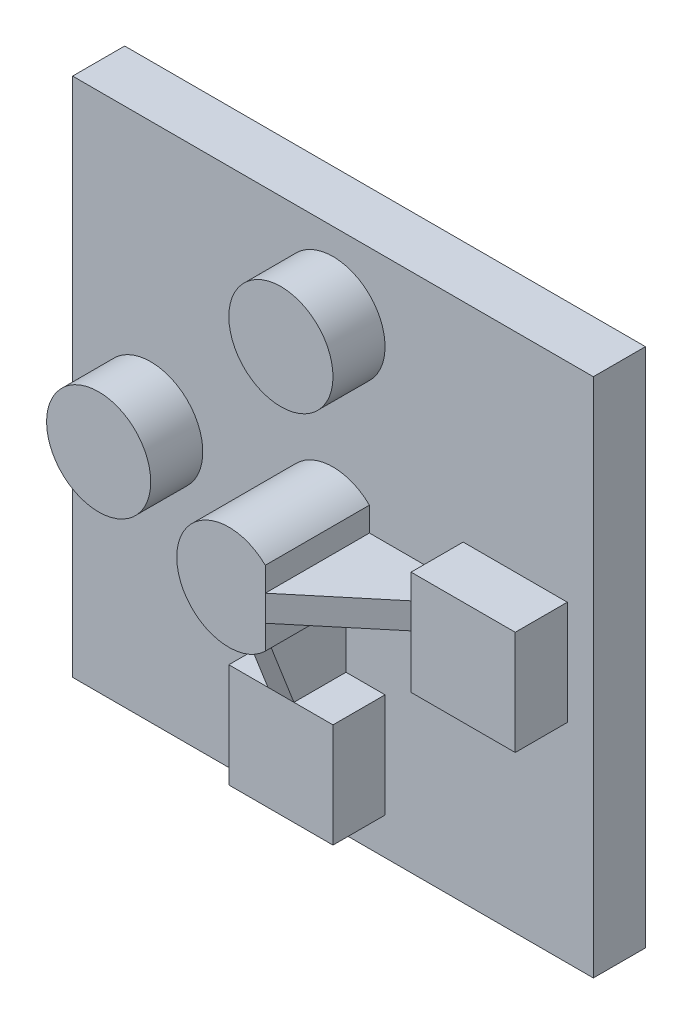
ISO-10303-21;
HEADER;
FILE_DESCRIPTION(('STEP AP214'),'2;1');
FILE_NAME('part.step','',(''),(''),'','','');
FILE_SCHEMA(('AUTOMOTIVE_DESIGN { 1 0 10303 214 1 1 1 1 }'));
ENDSEC;
DATA;
#1=APPLICATION_CONTEXT('core data for automotive mechanical design processes');
#2=APPLICATION_PROTOCOL_DEFINITION('international standard','automotive_design',2000,#1);
#3=PRODUCT_CONTEXT('',#1,'mechanical');
#4=PRODUCT('Part','Part','',(#3));
#5=PRODUCT_RELATED_PRODUCT_CATEGORY('part','',(#4));
#6=PRODUCT_DEFINITION_FORMATION('','',#4);
#7=PRODUCT_DEFINITION_CONTEXT('part definition',#1,'design');
#8=PRODUCT_DEFINITION('design','',#6,#7);
#9=PRODUCT_DEFINITION_SHAPE('','',#8);
#10=(LENGTH_UNIT() NAMED_UNIT(*) SI_UNIT(.MILLI.,.METRE.));
#11=(NAMED_UNIT(*) PLANE_ANGLE_UNIT() SI_UNIT($,.RADIAN.));
#12=(NAMED_UNIT(*) SI_UNIT($,.STERADIAN.) SOLID_ANGLE_UNIT());
#13=UNCERTAINTY_MEASURE_WITH_UNIT(LENGTH_MEASURE(1.E-05),#10,'distance_accuracy_value','');
#14=(GEOMETRIC_REPRESENTATION_CONTEXT(3) GLOBAL_UNCERTAINTY_ASSIGNED_CONTEXT((#13)) GLOBAL_UNIT_ASSIGNED_CONTEXT((#10,
#11,#12)) REPRESENTATION_CONTEXT('',''));
#15=CARTESIAN_POINT('',(0.,0.,0.));
#16=DIRECTION('',(0.,0.,1.));
#17=DIRECTION('',(1.,0.,0.));
#18=AXIS2_PLACEMENT_3D('',#15,#16,#17);
#19=CARTESIAN_POINT('',(0.,27.0986065540472,15.));
#20=DIRECTION('',(0.,1.,0.));
#21=DIRECTION('',(0.,0.,1.));
#22=AXIS2_PLACEMENT_3D('',#19,#20,#21);
#23=PLANE('',#22);
#24=DIRECTION('',(1.,0.,0.));
#25=VECTOR('',#24,1.);
#26=CARTESIAN_POINT('',(0.,27.0986065540472,5.));
#27=LINE('',#26,#25);
#28=CARTESIAN_POINT('',(52.5,27.0986065540472,5.));
#29=VERTEX_POINT('',#28);
#30=CARTESIAN_POINT('',(60.,27.0986065540472,5.));
#31=VERTEX_POINT('',#30);
#32=EDGE_CURVE('E322',#29,#31,#27,.T.);
#33=ORIENTED_EDGE('',*,*,#32,.F.);
#34=DIRECTION('',(0.,0.,1.));
#35=VECTOR('',#34,1.);
#36=CARTESIAN_POINT('',(52.5,27.0986065540472,15.));
#37=LINE('',#36,#35);
#38=CARTESIAN_POINT('',(52.5,27.0986065540472,15.));
#39=VERTEX_POINT('',#38);
#40=EDGE_CURVE('E219',#29,#39,#37,.T.);
#41=ORIENTED_EDGE('',*,*,#40,.T.);
#42=DIRECTION('',(1.,0.,0.));
#43=VECTOR('',#42,1.);
#44=CARTESIAN_POINT('',(0.,27.0986065540472,15.));
#45=LINE('',#44,#43);
#46=CARTESIAN_POINT('',(60.,27.0986065540472,15.));
#47=VERTEX_POINT('',#46);
#48=EDGE_CURVE('E311',#39,#47,#45,.T.);
#49=ORIENTED_EDGE('',*,*,#48,.T.);
#50=DIRECTION('',(0.,0.,-1.));
#51=VECTOR('',#50,1.);
#52=CARTESIAN_POINT('',(60.,27.0986065540472,15.));
#53=LINE('',#52,#51);
#54=EDGE_CURVE('E337',#47,#31,#53,.T.);
#55=ORIENTED_EDGE('',*,*,#54,.T.);
#56=EDGE_LOOP('',(#33,#41,#49,#55));
#57=FACE_BOUND('',#56,.T.);
#58=ADVANCED_FACE('F43',(#57),#23,.T.);
#59=CARTESIAN_POINT('',(57.,0.,25.));
#60=DIRECTION('',(1.,0.,0.));
#61=DIRECTION('',(0.,0.,-1.));
#62=AXIS2_PLACEMENT_3D('',#59,#60,#61);
#63=PLANE('',#62);
#64=DIRECTION('',(0.,-1.,0.));
#65=VECTOR('',#64,1.);
#66=CARTESIAN_POINT('',(57.,0.,25.));
#67=LINE('',#66,#65);
#68=CARTESIAN_POINT('',(57.,57.1414284285429,25.));
#69=VERTEX_POINT('',#68);
#70=CARTESIAN_POINT('',(57.,52.5,25.));
#71=VERTEX_POINT('',#70);
#72=EDGE_CURVE('E252',#69,#71,#67,.T.);
#73=ORIENTED_EDGE('',*,*,#72,.T.);
#74=DIRECTION('',(0.,0.,-1.));
#75=VECTOR('',#74,1.);
#76=CARTESIAN_POINT('',(57.,52.5,25.));
#77=LINE('',#76,#75);
#78=CARTESIAN_POINT('',(57.,52.5,5.));
#79=VERTEX_POINT('',#78);
#80=EDGE_CURVE('E232',#71,#79,#77,.T.);
#81=ORIENTED_EDGE('',*,*,#80,.T.);
#82=DIRECTION('',(0.,-1.,0.));
#83=VECTOR('',#82,1.);
#84=CARTESIAN_POINT('',(57.,0.,5.));
#85=LINE('',#84,#83);
#86=CARTESIAN_POINT('',(57.,57.1414284285429,5.));
#87=VERTEX_POINT('',#86);
#88=EDGE_CURVE('E260',#87,#79,#85,.T.);
#89=ORIENTED_EDGE('',*,*,#88,.F.);
#90=DIRECTION('',(0.,0.,-1.));
#91=VECTOR('',#90,1.);
#92=CARTESIAN_POINT('',(57.,57.1414284285429,25.));
#93=LINE('',#92,#91);
#94=EDGE_CURVE('E268',#69,#87,#93,.T.);
#95=ORIENTED_EDGE('',*,*,#94,.F.);
#96=EDGE_LOOP('',(#73,#81,#89,#95));
#97=FACE_BOUND('',#96,.T.);
#98=ADVANCED_FACE('F379',(#97),#63,.T.);
#99=CARTESIAN_POINT('',(0.,0.,5.));
#100=DIRECTION('',(0.,0.,-1.));
#101=DIRECTION('',(-1.,0.,0.));
#102=AXIS2_PLACEMENT_3D('',#99,#100,#101);
#103=PLANE('',#102);
#104=DIRECTION('',(0.,-1.,0.));
#105=VECTOR('',#104,1.);
#106=CARTESIAN_POINT('',(60.,0.,5.));
#107=LINE('',#106,#105);
#108=CARTESIAN_POINT('',(60.,7.09860655404718,5.));
#109=VERTEX_POINT('',#108);
#110=EDGE_CURVE('E307',#31,#109,#107,.T.);
#111=ORIENTED_EDGE('',*,*,#110,.T.);
#112=DIRECTION('',(1.,0.,0.));
#113=VECTOR('',#112,1.);
#114=CARTESIAN_POINT('',(0.,7.09860655404718,5.));
#115=LINE('',#114,#113);
#116=CARTESIAN_POINT('',(40.,7.09860655404718,5.));
#117=VERTEX_POINT('',#116);
#118=EDGE_CURVE('E312',#117,#109,#115,.T.);
#119=ORIENTED_EDGE('',*,*,#118,.F.);
#120=DIRECTION('',(0.,-1.,0.));
#121=VECTOR('',#120,1.);
#122=CARTESIAN_POINT('',(40.,0.,5.));
#123=LINE('',#122,#121);
#124=CARTESIAN_POINT('',(40.,27.0986065540472,5.));
#125=VERTEX_POINT('',#124);
#126=EDGE_CURVE('E325',#125,#117,#123,.T.);
#127=ORIENTED_EDGE('',*,*,#126,.F.);
#128=CARTESIAN_POINT('',(47.5,27.0986065540472,5.));
#129=VERTEX_POINT('',#128);
#130=EDGE_CURVE('E323',#125,#129,#27,.T.);
#131=ORIENTED_EDGE('',*,*,#130,.T.);
#132=DIRECTION('',(0.,1.,0.));
#133=VECTOR('',#132,1.);
#134=CARTESIAN_POINT('',(47.5,0.,5.));
#135=LINE('',#134,#133);
#136=CARTESIAN_POINT('',(47.5,40.3175416344815,5.));
#137=VERTEX_POINT('',#136);
#138=EDGE_CURVE('E222',#129,#137,#135,.T.);
#139=ORIENTED_EDGE('',*,*,#138,.T.);
#140=CARTESIAN_POINT('',(50.,50.,5.));
#141=DIRECTION('',(0.,0.,1.));
#142=DIRECTION('',(1.,0.,0.));
#143=AXIS2_PLACEMENT_3D('',#140,#141,#142);
#144=CIRCLE('',#143,10.);
#145=EDGE_CURVE('E264',#87,#137,#144,.T.);
#146=ORIENTED_EDGE('',*,*,#145,.F.);
#147=ORIENTED_EDGE('',*,*,#88,.T.);
#148=DIRECTION('',(-1.,0.,0.));
#149=VECTOR('',#148,1.);
#150=CARTESIAN_POINT('',(0.,52.5,5.));
#151=LINE('',#150,#149);
#152=CARTESIAN_POINT('',(75.,52.5,5.));
#153=VERTEX_POINT('',#152);
#154=EDGE_CURVE('E236',#153,#79,#151,.T.);
#155=ORIENTED_EDGE('',*,*,#154,.F.);
#156=DIRECTION('',(0.,-1.,0.));
#157=VECTOR('',#156,1.);
#158=CARTESIAN_POINT('',(75.,0.,5.));
#159=LINE('',#158,#157);
#160=CARTESIAN_POINT('',(75.,60.,5.));
#161=VERTEX_POINT('',#160);
#162=EDGE_CURVE('E291',#161,#153,#159,.T.);
#163=ORIENTED_EDGE('',*,*,#162,.F.);
#164=DIRECTION('',(1.,0.,0.));
#165=VECTOR('',#164,1.);
#166=CARTESIAN_POINT('',(0.,60.,5.));
#167=LINE('',#166,#165);
#168=CARTESIAN_POINT('',(95.,60.,5.));
#169=VERTEX_POINT('',#168);
#170=EDGE_CURVE('E288',#161,#169,#167,.T.);
#171=ORIENTED_EDGE('',*,*,#170,.T.);
#172=DIRECTION('',(0.,-1.,0.));
#173=VECTOR('',#172,1.);
#174=CARTESIAN_POINT('',(95.,0.,5.));
#175=LINE('',#174,#173);
#176=CARTESIAN_POINT('',(95.,40.,5.));
#177=VERTEX_POINT('',#176);
#178=EDGE_CURVE('E274',#169,#177,#175,.T.);
#179=ORIENTED_EDGE('',*,*,#178,.T.);
#180=DIRECTION('',(1.,0.,0.));
#181=VECTOR('',#180,1.);
#182=CARTESIAN_POINT('',(0.,40.,5.));
#183=LINE('',#182,#181);
#184=CARTESIAN_POINT('',(75.,40.,5.));
#185=VERTEX_POINT('',#184);
#186=EDGE_CURVE('E279',#185,#177,#183,.T.);
#187=ORIENTED_EDGE('',*,*,#186,.F.);
#188=CARTESIAN_POINT('',(75.,47.5,5.));
#189=VERTEX_POINT('',#188);
#190=EDGE_CURVE('E290',#189,#185,#159,.T.);
#191=ORIENTED_EDGE('',*,*,#190,.F.);
#192=DIRECTION('',(-1.,0.,0.));
#193=VECTOR('',#192,1.);
#194=CARTESIAN_POINT('',(0.,47.5,5.));
#195=LINE('',#194,#193);
#196=CARTESIAN_POINT('',(57.,47.5,5.));
#197=VERTEX_POINT('',#196);
#198=EDGE_CURVE('E245',#189,#197,#195,.T.);
#199=ORIENTED_EDGE('',*,*,#198,.T.);
#200=CARTESIAN_POINT('',(57.,42.8585715714571,5.));
#201=VERTEX_POINT('',#200);
#202=EDGE_CURVE('E251',#197,#201,#85,.T.);
#203=ORIENTED_EDGE('',*,*,#202,.T.);
#204=CARTESIAN_POINT('',(52.5,40.3175416344815,5.));
#205=VERTEX_POINT('',#204);
#206=EDGE_CURVE('E263',#205,#201,#144,.T.);
#207=ORIENTED_EDGE('',*,*,#206,.F.);
#208=DIRECTION('',(0.,1.,0.));
#209=VECTOR('',#208,1.);
#210=CARTESIAN_POINT('',(52.5,0.,5.));
#211=LINE('',#210,#209);
#212=EDGE_CURVE('E58',#29,#205,#211,.T.);
#213=ORIENTED_EDGE('',*,*,#212,.F.);
#214=ORIENTED_EDGE('',*,*,#32,.T.);
#215=EDGE_LOOP('',(#111,#119,#127,#131,#139,#146,#147,#155,#163,#171,#179,#187,#191,#199,#203,
#207,#213,#214));
#216=FACE_BOUND('',#215,.T.);
#217=CARTESIAN_POINT('',(50.,85.,5.));
#218=DIRECTION('',(0.,0.,-1.));
#219=DIRECTION('',(-1.,0.,0.));
#220=AXIS2_PLACEMENT_3D('',#217,#218,#219);
#221=CIRCLE('',#220,10.);
#222=CARTESIAN_POINT('',(40.,85.,5.));
#223=VERTEX_POINT('',#222);
#224=EDGE_CURVE('E51',#223,#223,#221,.F.);
#225=ORIENTED_EDGE('',*,*,#224,.F.);
#226=EDGE_LOOP('',(#225));
#227=FACE_BOUND('',#226,.T.);
#228=DIRECTION('',(-1.,0.,0.));
#229=VECTOR('',#228,1.);
#230=CARTESIAN_POINT('',(0.,100.,5.));
#231=LINE('',#230,#229);
#232=CARTESIAN_POINT('',(100.,100.,5.));
#233=VERTEX_POINT('',#232);
#234=CARTESIAN_POINT('',(0.,100.,5.));
#235=VERTEX_POINT('',#234);
#236=EDGE_CURVE('E351',#233,#235,#231,.T.);
#237=ORIENTED_EDGE('',*,*,#236,.T.);
#238=DIRECTION('',(0.,-1.,0.));
#239=VECTOR('',#238,1.);
#240=CARTESIAN_POINT('',(0.,0.,5.));
#241=LINE('',#240,#239);
#242=CARTESIAN_POINT('',(0.,0.,5.));
#243=VERTEX_POINT('',#242);
#244=EDGE_CURVE('E344',#235,#243,#241,.T.);
#245=ORIENTED_EDGE('',*,*,#244,.T.);
#246=DIRECTION('',(1.,0.,0.));
#247=VECTOR('',#246,1.);
#248=CARTESIAN_POINT('',(100.,0.,5.));
#249=LINE('',#248,#247);
#250=CARTESIAN_POINT('',(100.,0.,5.));
#251=VERTEX_POINT('',#250);
#252=EDGE_CURVE('E346',#243,#251,#249,.T.);
#253=ORIENTED_EDGE('',*,*,#252,.T.);
#254=DIRECTION('',(0.,1.,0.));
#255=VECTOR('',#254,1.);
#256=CARTESIAN_POINT('',(100.,100.,5.));
#257=LINE('',#256,#255);
#258=EDGE_CURVE('E349',#251,#233,#257,.T.);
#259=ORIENTED_EDGE('',*,*,#258,.T.);
#260=EDGE_LOOP('',(#237,#245,#253,#259));
#261=FACE_BOUND('',#260,.T.);
#262=CARTESIAN_POINT('',(15.,50.,5.));
#263=DIRECTION('',(0.,0.,-1.));
#264=DIRECTION('',(-1.,0.,0.));
#265=AXIS2_PLACEMENT_3D('',#262,#263,#264);
#266=CIRCLE('',#265,10.);
#267=CARTESIAN_POINT('',(4.99999999999999,50.,5.));
#268=VERTEX_POINT('',#267);
#269=EDGE_CURVE('E11',#268,#268,#266,.F.);
#270=ORIENTED_EDGE('',*,*,#269,.F.);
#271=EDGE_LOOP('',(#270));
#272=FACE_BOUND('',#271,.T.);
#273=ADVANCED_FACE('F376',(#216,#227,#261,#272),#103,.F.);
#274=CARTESIAN_POINT('',(0.,0.,5.));
#275=DIRECTION('',(1.,0.,0.));
#276=DIRECTION('',(0.,0.,-1.));
#277=AXIS2_PLACEMENT_3D('',#274,#275,#276);
#278=PLANE('',#277);
#279=DIRECTION('',(0.,0.,-1.));
#280=VECTOR('',#279,1.);
#281=CARTESIAN_POINT('',(0.,0.,5.));
#282=LINE('',#281,#280);
#283=CARTESIAN_POINT('',(0.,0.,-5.));
#284=VERTEX_POINT('',#283);
#285=EDGE_CURVE('E368',#243,#284,#282,.T.);
#286=ORIENTED_EDGE('',*,*,#285,.F.);
#287=ORIENTED_EDGE('',*,*,#244,.F.);
#288=DIRECTION('',(0.,0.,-1.));
#289=VECTOR('',#288,1.);
#290=CARTESIAN_POINT('',(0.,100.,5.));
#291=LINE('',#290,#289);
#292=CARTESIAN_POINT('',(0.,100.,-5.));
#293=VERTEX_POINT('',#292);
#294=EDGE_CURVE('E353',#235,#293,#291,.T.);
#295=ORIENTED_EDGE('',*,*,#294,.T.);
#296=DIRECTION('',(0.,-1.,0.));
#297=VECTOR('',#296,1.);
#298=CARTESIAN_POINT('',(0.,0.,-5.));
#299=LINE('',#298,#297);
#300=EDGE_CURVE('E343',#293,#284,#299,.T.);
#301=ORIENTED_EDGE('',*,*,#300,.T.);
#302=EDGE_LOOP('',(#286,#287,#295,#301));
#303=FACE_BOUND('',#302,.T.);
#304=ADVANCED_FACE('F45',(#303),#278,.F.);
#305=CARTESIAN_POINT('',(100.,0.,5.));
#306=DIRECTION('',(0.,1.,0.));
#307=DIRECTION('',(0.,0.,1.));
#308=AXIS2_PLACEMENT_3D('',#305,#306,#307);
#309=PLANE('',#308);
#310=DIRECTION('',(1.,0.,0.));
#311=VECTOR('',#310,1.);
#312=CARTESIAN_POINT('',(100.,0.,-5.));
#313=LINE('',#312,#311);
#314=CARTESIAN_POINT('',(100.,0.,-5.));
#315=VERTEX_POINT('',#314);
#316=EDGE_CURVE('E355',#284,#315,#313,.T.);
#317=ORIENTED_EDGE('',*,*,#316,.T.);
#318=DIRECTION('',(0.,0.,-1.));
#319=VECTOR('',#318,1.);
#320=CARTESIAN_POINT('',(100.,0.,5.));
#321=LINE('',#320,#319);
#322=EDGE_CURVE('E365',#251,#315,#321,.T.);
#323=ORIENTED_EDGE('',*,*,#322,.F.);
#324=ORIENTED_EDGE('',*,*,#252,.F.);
#325=ORIENTED_EDGE('',*,*,#285,.T.);
#326=EDGE_LOOP('',(#317,#323,#324,#325));
#327=FACE_BOUND('',#326,.T.);
#328=ADVANCED_FACE('F442',(#327),#309,.F.);
#329=CARTESIAN_POINT('',(100.,100.,5.));
#330=DIRECTION('',(-1.,0.,0.));
#331=DIRECTION('',(0.,-1.,0.));
#332=AXIS2_PLACEMENT_3D('',#329,#330,#331);
#333=PLANE('',#332);
#334=DIRECTION('',(0.,1.,0.));
#335=VECTOR('',#334,1.);
#336=CARTESIAN_POINT('',(100.,100.,-5.));
#337=LINE('',#336,#335);
#338=CARTESIAN_POINT('',(100.,100.,-5.));
#339=VERTEX_POINT('',#338);
#340=EDGE_CURVE('E357',#315,#339,#337,.T.);
#341=ORIENTED_EDGE('',*,*,#340,.T.);
#342=DIRECTION('',(0.,0.,-1.));
#343=VECTOR('',#342,1.);
#344=CARTESIAN_POINT('',(100.,100.,5.));
#345=LINE('',#344,#343);
#346=EDGE_CURVE('E362',#233,#339,#345,.T.);
#347=ORIENTED_EDGE('',*,*,#346,.F.);
#348=ORIENTED_EDGE('',*,*,#258,.F.);
#349=ORIENTED_EDGE('',*,*,#322,.T.);
#350=EDGE_LOOP('',(#341,#347,#348,#349));
#351=FACE_BOUND('',#350,.T.);
#352=ADVANCED_FACE('F439',(#351),#333,.F.);
#353=CARTESIAN_POINT('',(0.,100.,5.));
#354=DIRECTION('',(0.,-1.,0.));
#355=DIRECTION('',(0.,0.,-1.));
#356=AXIS2_PLACEMENT_3D('',#353,#354,#355);
#357=PLANE('',#356);
#358=ORIENTED_EDGE('',*,*,#294,.F.);
#359=ORIENTED_EDGE('',*,*,#236,.F.);
#360=ORIENTED_EDGE('',*,*,#346,.T.);
#361=DIRECTION('',(-1.,0.,0.));
#362=VECTOR('',#361,1.);
#363=CARTESIAN_POINT('',(0.,100.,-5.));
#364=LINE('',#363,#362);
#365=EDGE_CURVE('E347',#339,#293,#364,.T.);
#366=ORIENTED_EDGE('',*,*,#365,.T.);
#367=EDGE_LOOP('',(#358,#359,#360,#366));
#368=FACE_BOUND('',#367,.T.);
#369=ADVANCED_FACE('F435',(#368),#357,.F.);
#370=CARTESIAN_POINT('',(0.,0.,-5.));
#371=DIRECTION('',(0.,0.,-1.));
#372=DIRECTION('',(-1.,0.,0.));
#373=AXIS2_PLACEMENT_3D('',#370,#371,#372);
#374=PLANE('',#373);
#375=ORIENTED_EDGE('',*,*,#300,.F.);
#376=ORIENTED_EDGE('',*,*,#365,.F.);
#377=ORIENTED_EDGE('',*,*,#340,.F.);
#378=ORIENTED_EDGE('',*,*,#316,.F.);
#379=EDGE_LOOP('',(#375,#376,#377,#378));
#380=FACE_BOUND('',#379,.T.);
#381=ADVANCED_FACE('F431',(#380),#374,.T.);
#382=CARTESIAN_POINT('',(50.,85.,15.));
#383=DIRECTION('',(0.,0.,-1.));
#384=DIRECTION('',(-1.,0.,0.));
#385=AXIS2_PLACEMENT_3D('',#382,#383,#384);
#386=CYLINDRICAL_SURFACE('',#385,10.);
#387=ORIENTED_EDGE('',*,*,#224,.T.);
#388=EDGE_LOOP('',(#387));
#389=FACE_BOUND('',#388,.T.);
#390=CARTESIAN_POINT('',(50.,85.,15.));
#391=DIRECTION('',(0.,0.,1.));
#392=DIRECTION('',(1.,0.,0.));
#393=AXIS2_PLACEMENT_3D('',#390,#391,#392);
#394=CIRCLE('',#393,10.);
#395=CARTESIAN_POINT('',(60.,85.,15.));
#396=VERTEX_POINT('',#395);
#397=EDGE_CURVE('E340',#396,#396,#394,.T.);
#398=ORIENTED_EDGE('',*,*,#397,.F.);
#399=EDGE_LOOP('',(#398));
#400=FACE_BOUND('',#399,.T.);
#401=ADVANCED_FACE('F373',(#389,#400),#386,.T.);
#402=CARTESIAN_POINT('',(0.,0.,15.));
#403=DIRECTION('',(0.,0.,1.));
#404=DIRECTION('',(1.,0.,0.));
#405=AXIS2_PLACEMENT_3D('',#402,#403,#404);
#406=PLANE('',#405);
#407=ORIENTED_EDGE('',*,*,#397,.T.);
#408=EDGE_LOOP('',(#407));
#409=FACE_BOUND('',#408,.T.);
#410=ADVANCED_FACE('F421',(#409),#406,.T.);
#411=CARTESIAN_POINT('',(60.,0.,15.));
#412=DIRECTION('',(1.,0.,0.));
#413=DIRECTION('',(0.,1.,0.));
#414=AXIS2_PLACEMENT_3D('',#411,#412,#413);
#415=PLANE('',#414);
#416=ORIENTED_EDGE('',*,*,#110,.F.);
#417=ORIENTED_EDGE('',*,*,#54,.F.);
#418=DIRECTION('',(0.,-1.,0.));
#419=VECTOR('',#418,1.);
#420=CARTESIAN_POINT('',(60.,0.,15.));
#421=LINE('',#420,#419);
#422=CARTESIAN_POINT('',(60.,7.09860655404718,15.));
#423=VERTEX_POINT('',#422);
#424=EDGE_CURVE('E308',#47,#423,#421,.T.);
#425=ORIENTED_EDGE('',*,*,#424,.T.);
#426=DIRECTION('',(0.,0.,-1.));
#427=VECTOR('',#426,1.);
#428=CARTESIAN_POINT('',(60.,7.09860655404718,15.));
#429=LINE('',#428,#427);
#430=EDGE_CURVE('E319',#423,#109,#429,.T.);
#431=ORIENTED_EDGE('',*,*,#430,.T.);
#432=EDGE_LOOP('',(#416,#417,#425,#431));
#433=FACE_BOUND('',#432,.T.);
#434=ADVANCED_FACE('F414',(#433),#415,.T.);
#435=DIRECTION('',(0.,0.,1.));
#436=VECTOR('',#435,1.);
#437=CARTESIAN_POINT('',(47.5,27.0986065540472,15.));
#438=LINE('',#437,#436);
#439=CARTESIAN_POINT('',(47.5,27.0986065540472,15.));
#440=VERTEX_POINT('',#439);
#441=EDGE_CURVE('E66',#129,#440,#438,.T.);
#442=ORIENTED_EDGE('',*,*,#441,.F.);
#443=ORIENTED_EDGE('',*,*,#130,.F.);
#444=DIRECTION('',(0.,0.,-1.));
#445=VECTOR('',#444,1.);
#446=CARTESIAN_POINT('',(40.,27.0986065540472,15.));
#447=LINE('',#446,#445);
#448=CARTESIAN_POINT('',(40.,27.0986065540472,15.));
#449=VERTEX_POINT('',#448);
#450=EDGE_CURVE('E334',#449,#125,#447,.T.);
#451=ORIENTED_EDGE('',*,*,#450,.F.);
#452=EDGE_CURVE('E313',#449,#440,#45,.T.);
#453=ORIENTED_EDGE('',*,*,#452,.T.);
#454=EDGE_LOOP('',(#442,#443,#451,#453));
#455=FACE_BOUND('',#454,.T.);
#456=ADVANCED_FACE('F405',(#455),#23,.T.);
#457=CARTESIAN_POINT('',(40.,0.,15.));
#458=DIRECTION('',(1.,0.,0.));
#459=DIRECTION('',(0.,0.,-1.));
#460=AXIS2_PLACEMENT_3D('',#457,#458,#459);
#461=PLANE('',#460);
#462=ORIENTED_EDGE('',*,*,#126,.T.);
#463=DIRECTION('',(0.,0.,-1.));
#464=VECTOR('',#463,1.);
#465=CARTESIAN_POINT('',(40.,7.09860655404718,15.));
#466=LINE('',#465,#464);
#467=CARTESIAN_POINT('',(40.,7.09860655404718,15.));
#468=VERTEX_POINT('',#467);
#469=EDGE_CURVE('E331',#468,#117,#466,.T.);
#470=ORIENTED_EDGE('',*,*,#469,.F.);
#471=DIRECTION('',(0.,-1.,0.));
#472=VECTOR('',#471,1.);
#473=CARTESIAN_POINT('',(40.,0.,15.));
#474=LINE('',#473,#472);
#475=EDGE_CURVE('E315',#449,#468,#474,.T.);
#476=ORIENTED_EDGE('',*,*,#475,.F.);
#477=ORIENTED_EDGE('',*,*,#450,.T.);
#478=EDGE_LOOP('',(#462,#470,#476,#477));
#479=FACE_BOUND('',#478,.T.);
#480=ADVANCED_FACE('F413',(#479),#461,.F.);
#481=CARTESIAN_POINT('',(0.,7.09860655404718,15.));
#482=DIRECTION('',(0.,1.,0.));
#483=DIRECTION('',(0.,0.,1.));
#484=AXIS2_PLACEMENT_3D('',#481,#482,#483);
#485=PLANE('',#484);
#486=ORIENTED_EDGE('',*,*,#118,.T.);
#487=ORIENTED_EDGE('',*,*,#430,.F.);
#488=DIRECTION('',(1.,0.,0.));
#489=VECTOR('',#488,1.);
#490=CARTESIAN_POINT('',(0.,7.09860655404718,15.));
#491=LINE('',#490,#489);
#492=EDGE_CURVE('E317',#468,#423,#491,.T.);
#493=ORIENTED_EDGE('',*,*,#492,.F.);
#494=ORIENTED_EDGE('',*,*,#469,.T.);
#495=EDGE_LOOP('',(#486,#487,#493,#494));
#496=FACE_BOUND('',#495,.T.);
#497=ADVANCED_FACE('F419',(#496),#485,.F.);
#498=CARTESIAN_POINT('',(0.,0.,15.));
#499=DIRECTION('',(0.,0.,1.));
#500=DIRECTION('',(1.,0.,0.));
#501=AXIS2_PLACEMENT_3D('',#498,#499,#500);
#502=PLANE('',#501);
#503=ORIENTED_EDGE('',*,*,#424,.F.);
#504=ORIENTED_EDGE('',*,*,#48,.F.);
#505=DIRECTION('',(1.,0.,0.));
#506=VECTOR('',#505,1.);
#507=CARTESIAN_POINT('',(0.,27.0986065540472,15.));
#508=LINE('',#507,#506);
#509=EDGE_CURVE('E205',#440,#39,#508,.T.);
#510=ORIENTED_EDGE('',*,*,#509,.F.);
#511=ORIENTED_EDGE('',*,*,#452,.F.);
#512=ORIENTED_EDGE('',*,*,#475,.T.);
#513=ORIENTED_EDGE('',*,*,#492,.T.);
#514=EDGE_LOOP('',(#503,#504,#510,#511,#512,#513));
#515=FACE_BOUND('',#514,.T.);
#516=ADVANCED_FACE('F519',(#515),#502,.T.);
#517=CARTESIAN_POINT('',(95.,0.,15.));
#518=DIRECTION('',(1.,0.,0.));
#519=DIRECTION('',(0.,1.,0.));
#520=AXIS2_PLACEMENT_3D('',#517,#518,#519);
#521=PLANE('',#520);
#522=ORIENTED_EDGE('',*,*,#178,.F.);
#523=DIRECTION('',(0.,0.,-1.));
#524=VECTOR('',#523,1.);
#525=CARTESIAN_POINT('',(95.,60.,15.));
#526=LINE('',#525,#524);
#527=CARTESIAN_POINT('',(95.,60.,15.));
#528=VERTEX_POINT('',#527);
#529=EDGE_CURVE('E304',#528,#169,#526,.T.);
#530=ORIENTED_EDGE('',*,*,#529,.F.);
#531=DIRECTION('',(0.,-1.,0.));
#532=VECTOR('',#531,1.);
#533=CARTESIAN_POINT('',(95.,0.,15.));
#534=LINE('',#533,#532);
#535=CARTESIAN_POINT('',(95.,40.,15.));
#536=VERTEX_POINT('',#535);
#537=EDGE_CURVE('E275',#528,#536,#534,.T.);
#538=ORIENTED_EDGE('',*,*,#537,.T.);
#539=DIRECTION('',(0.,0.,-1.));
#540=VECTOR('',#539,1.);
#541=CARTESIAN_POINT('',(95.,40.,15.));
#542=LINE('',#541,#540);
#543=EDGE_CURVE('E286',#536,#177,#542,.T.);
#544=ORIENTED_EDGE('',*,*,#543,.T.);
#545=EDGE_LOOP('',(#522,#530,#538,#544));
#546=FACE_BOUND('',#545,.T.);
#547=ADVANCED_FACE('F508',(#546),#521,.T.);
#548=CARTESIAN_POINT('',(0.,60.,15.));
#549=DIRECTION('',(0.,1.,0.));
#550=DIRECTION('',(0.,0.,1.));
#551=AXIS2_PLACEMENT_3D('',#548,#549,#550);
#552=PLANE('',#551);
#553=ORIENTED_EDGE('',*,*,#170,.F.);
#554=DIRECTION('',(0.,0.,-1.));
#555=VECTOR('',#554,1.);
#556=CARTESIAN_POINT('',(75.,60.,15.));
#557=LINE('',#556,#555);
#558=CARTESIAN_POINT('',(75.,60.,15.));
#559=VERTEX_POINT('',#558);
#560=EDGE_CURVE('E301',#559,#161,#557,.T.);
#561=ORIENTED_EDGE('',*,*,#560,.F.);
#562=DIRECTION('',(1.,0.,0.));
#563=VECTOR('',#562,1.);
#564=CARTESIAN_POINT('',(0.,60.,15.));
#565=LINE('',#564,#563);
#566=EDGE_CURVE('E278',#559,#528,#565,.T.);
#567=ORIENTED_EDGE('',*,*,#566,.T.);
#568=ORIENTED_EDGE('',*,*,#529,.T.);
#569=EDGE_LOOP('',(#553,#561,#567,#568));
#570=FACE_BOUND('',#569,.T.);
#571=ADVANCED_FACE('F503',(#570),#552,.T.);
#572=CARTESIAN_POINT('',(75.,0.,15.));
#573=DIRECTION('',(1.,0.,0.));
#574=DIRECTION('',(0.,1.,0.));
#575=AXIS2_PLACEMENT_3D('',#572,#573,#574);
#576=PLANE('',#575);
#577=DIRECTION('',(0.,-1.,0.));
#578=VECTOR('',#577,1.);
#579=CARTESIAN_POINT('',(75.,0.,9.99999999999997));
#580=LINE('',#579,#578);
#581=CARTESIAN_POINT('',(75.,52.5,10.));
#582=VERTEX_POINT('',#581);
#583=CARTESIAN_POINT('',(75.,47.5,9.99999999999999));
#584=VERTEX_POINT('',#583);
#585=EDGE_CURVE('E249',#582,#584,#580,.T.);
#586=ORIENTED_EDGE('',*,*,#585,.T.);
#587=DIRECTION('',(0.,0.,-1.));
#588=VECTOR('',#587,1.);
#589=CARTESIAN_POINT('',(75.,47.5,15.));
#590=LINE('',#589,#588);
#591=EDGE_CURVE('E247',#584,#189,#590,.T.);
#592=ORIENTED_EDGE('',*,*,#591,.T.);
#593=ORIENTED_EDGE('',*,*,#190,.T.);
#594=DIRECTION('',(0.,0.,-1.));
#595=VECTOR('',#594,1.);
#596=CARTESIAN_POINT('',(75.,40.,15.));
#597=LINE('',#596,#595);
#598=CARTESIAN_POINT('',(75.,40.,15.));
#599=VERTEX_POINT('',#598);
#600=EDGE_CURVE('E298',#599,#185,#597,.T.);
#601=ORIENTED_EDGE('',*,*,#600,.F.);
#602=DIRECTION('',(0.,-1.,0.));
#603=VECTOR('',#602,1.);
#604=CARTESIAN_POINT('',(75.,0.,15.));
#605=LINE('',#604,#603);
#606=EDGE_CURVE('E282',#559,#599,#605,.T.);
#607=ORIENTED_EDGE('',*,*,#606,.F.);
#608=ORIENTED_EDGE('',*,*,#560,.T.);
#609=ORIENTED_EDGE('',*,*,#162,.T.);
#610=DIRECTION('',(0.,0.,-1.));
#611=VECTOR('',#610,1.);
#612=CARTESIAN_POINT('',(75.,52.5,15.));
#613=LINE('',#612,#611);
#614=EDGE_CURVE('E239',#582,#153,#613,.T.);
#615=ORIENTED_EDGE('',*,*,#614,.F.);
#616=EDGE_LOOP('',(#586,#592,#593,#601,#607,#608,#609,#615));
#617=FACE_BOUND('',#616,.T.);
#618=ADVANCED_FACE('F494',(#617),#576,.F.);
#619=CARTESIAN_POINT('',(0.,40.,15.));
#620=DIRECTION('',(0.,1.,0.));
#621=DIRECTION('',(0.,0.,1.));
#622=AXIS2_PLACEMENT_3D('',#619,#620,#621);
#623=PLANE('',#622);
#624=ORIENTED_EDGE('',*,*,#186,.T.);
#625=ORIENTED_EDGE('',*,*,#543,.F.);
#626=DIRECTION('',(1.,0.,0.));
#627=VECTOR('',#626,1.);
#628=CARTESIAN_POINT('',(0.,40.,15.));
#629=LINE('',#628,#627);
#630=EDGE_CURVE('E284',#599,#536,#629,.T.);
#631=ORIENTED_EDGE('',*,*,#630,.F.);
#632=ORIENTED_EDGE('',*,*,#600,.T.);
#633=EDGE_LOOP('',(#624,#625,#631,#632));
#634=FACE_BOUND('',#633,.T.);
#635=ADVANCED_FACE('F482',(#634),#623,.F.);
#636=CARTESIAN_POINT('',(0.,0.,15.));
#637=DIRECTION('',(0.,0.,1.));
#638=DIRECTION('',(1.,0.,0.));
#639=AXIS2_PLACEMENT_3D('',#636,#637,#638);
#640=PLANE('',#639);
#641=ORIENTED_EDGE('',*,*,#537,.F.);
#642=ORIENTED_EDGE('',*,*,#566,.F.);
#643=ORIENTED_EDGE('',*,*,#606,.T.);
#644=ORIENTED_EDGE('',*,*,#630,.T.);
#645=EDGE_LOOP('',(#641,#642,#643,#644));
#646=FACE_BOUND('',#645,.T.);
#647=ADVANCED_FACE('F390',(#646),#640,.T.);
#648=CARTESIAN_POINT('',(15.,50.,15.));
#649=DIRECTION('',(0.,0.,-1.));
#650=DIRECTION('',(-1.,0.,0.));
#651=AXIS2_PLACEMENT_3D('',#648,#649,#650);
#652=CYLINDRICAL_SURFACE('',#651,10.);
#653=ORIENTED_EDGE('',*,*,#269,.T.);
#654=EDGE_LOOP('',(#653));
#655=FACE_BOUND('',#654,.T.);
#656=CARTESIAN_POINT('',(15.,50.,15.));
#657=DIRECTION('',(0.,0.,1.));
#658=DIRECTION('',(1.,0.,0.));
#659=AXIS2_PLACEMENT_3D('',#656,#657,#658);
#660=CIRCLE('',#659,10.);
#661=CARTESIAN_POINT('',(25.,50.,15.));
#662=VERTEX_POINT('',#661);
#663=EDGE_CURVE('E271',#662,#662,#660,.T.);
#664=ORIENTED_EDGE('',*,*,#663,.F.);
#665=EDGE_LOOP('',(#664));
#666=FACE_BOUND('',#665,.T.);
#667=ADVANCED_FACE('F386',(#655,#666),#652,.T.);
#668=CARTESIAN_POINT('',(0.,0.,15.));
#669=DIRECTION('',(0.,0.,1.));
#670=DIRECTION('',(1.,0.,0.));
#671=AXIS2_PLACEMENT_3D('',#668,#669,#670);
#672=PLANE('',#671);
#673=ORIENTED_EDGE('',*,*,#663,.T.);
#674=EDGE_LOOP('',(#673));
#675=FACE_BOUND('',#674,.T.);
#676=ADVANCED_FACE('F389',(#675),#672,.T.);
#677=DIRECTION('',(0.,0.,-1.));
#678=VECTOR('',#677,1.);
#679=CARTESIAN_POINT('',(57.,47.5,25.));
#680=LINE('',#679,#678);
#681=CARTESIAN_POINT('',(57.,47.5,25.));
#682=VERTEX_POINT('',#681);
#683=EDGE_CURVE('E242',#682,#197,#680,.T.);
#684=ORIENTED_EDGE('',*,*,#683,.F.);
#685=CARTESIAN_POINT('',(57.,42.8585715714571,25.));
#686=VERTEX_POINT('',#685);
#687=EDGE_CURVE('E257',#682,#686,#67,.T.);
#688=ORIENTED_EDGE('',*,*,#687,.T.);
#689=DIRECTION('',(0.,0.,-1.));
#690=VECTOR('',#689,1.);
#691=CARTESIAN_POINT('',(57.,42.8585715714571,25.));
#692=LINE('',#691,#690);
#693=EDGE_CURVE('E259',#686,#201,#692,.T.);
#694=ORIENTED_EDGE('',*,*,#693,.T.);
#695=ORIENTED_EDGE('',*,*,#202,.F.);
#696=EDGE_LOOP('',(#684,#688,#694,#695));
#697=FACE_BOUND('',#696,.T.);
#698=ADVANCED_FACE('F395',(#697),#63,.T.);
#699=CARTESIAN_POINT('',(50.,50.,25.));
#700=DIRECTION('',(0.,0.,-1.));
#701=DIRECTION('',(-1.,0.,0.));
#702=AXIS2_PLACEMENT_3D('',#699,#700,#701);
#703=CYLINDRICAL_SURFACE('',#702,10.);
#704=ORIENTED_EDGE('',*,*,#693,.F.);
#705=CARTESIAN_POINT('',(50.,50.,25.));
#706=DIRECTION('',(0.,0.,1.));
#707=DIRECTION('',(1.,0.,0.));
#708=AXIS2_PLACEMENT_3D('',#705,#706,#707);
#709=CIRCLE('',#708,10.);
#710=EDGE_CURVE('E255',#69,#686,#709,.T.);
#711=ORIENTED_EDGE('',*,*,#710,.F.);
#712=ORIENTED_EDGE('',*,*,#94,.T.);
#713=ORIENTED_EDGE('',*,*,#145,.T.);
#714=DIRECTION('',(0.,0.,-1.));
#715=VECTOR('',#714,1.);
#716=CARTESIAN_POINT('',(47.5,40.3175416344815,25.));
#717=LINE('',#716,#715);
#718=CARTESIAN_POINT('',(47.5,40.3175416344815,20.1230648595486));
#719=VERTEX_POINT('',#718);
#720=EDGE_CURVE('E200',#137,#719,#717,.F.);
#721=ORIENTED_EDGE('',*,*,#720,.T.);
#722=CARTESIAN_POINT('',(50.,50.,23.8755503589176));
#723=DIRECTION('',(0.,-0.361365684583722,0.932424174936138));
#724=DIRECTION('',(0.,-0.932424174936138,-0.361365684583722));
#725=AXIS2_PLACEMENT_3D('',#722,#723,#724);
#726=ELLIPSE('',#725,10.7247326579503,10.);
#727=CARTESIAN_POINT('',(52.5,40.3175416344815,20.1230648595486));
#728=VERTEX_POINT('',#727);
#729=EDGE_CURVE('E194',#719,#728,#726,.T.);
#730=ORIENTED_EDGE('',*,*,#729,.T.);
#731=DIRECTION('',(0.,0.,-1.));
#732=VECTOR('',#731,1.);
#733=CARTESIAN_POINT('',(52.5,40.3175416344815,25.));
#734=LINE('',#733,#732);
#735=EDGE_CURVE('E198',#205,#728,#734,.F.);
#736=ORIENTED_EDGE('',*,*,#735,.F.);
#737=ORIENTED_EDGE('',*,*,#206,.T.);
#738=EDGE_LOOP('',(#704,#711,#712,#713,#721,#730,#736,#737));
#739=FACE_BOUND('',#738,.T.);
#740=ADVANCED_FACE('F197',(#739),#703,.T.);
#741=CARTESIAN_POINT('',(0.,0.,25.));
#742=DIRECTION('',(0.,0.,1.));
#743=DIRECTION('',(1.,0.,0.));
#744=AXIS2_PLACEMENT_3D('',#741,#742,#743);
#745=PLANE('',#744);
#746=ORIENTED_EDGE('',*,*,#710,.T.);
#747=ORIENTED_EDGE('',*,*,#687,.F.);
#748=EDGE_CURVE('E256',#71,#682,#67,.T.);
#749=ORIENTED_EDGE('',*,*,#748,.F.);
#750=ORIENTED_EDGE('',*,*,#72,.F.);
#751=EDGE_LOOP('',(#746,#747,#749,#750));
#752=FACE_BOUND('',#751,.T.);
#753=ADVANCED_FACE('F594',(#752),#745,.T.);
#754=CARTESIAN_POINT('',(75.,50.,10.));
#755=DIRECTION('',(0.64018439966448,0.,0.768221279597376));
#756=DIRECTION('',(-0.768221279597376,0.,0.64018439966448));
#757=AXIS2_PLACEMENT_3D('',#754,#755,#756);
#758=PLANE('',#757);
#759=ORIENTED_EDGE('',*,*,#585,.F.);
#760=DIRECTION('',(-0.768221279597376,0.,0.64018439966448));
#761=VECTOR('',#760,1.);
#762=CARTESIAN_POINT('',(75.,52.5,10.));
#763=LINE('',#762,#761);
#764=EDGE_CURVE('E228',#582,#71,#763,.T.);
#765=ORIENTED_EDGE('',*,*,#764,.T.);
#766=ORIENTED_EDGE('',*,*,#748,.T.);
#767=DIRECTION('',(-0.768221279597376,0.,0.64018439966448));
#768=VECTOR('',#767,1.);
#769=CARTESIAN_POINT('',(75.,47.5,10.));
#770=LINE('',#769,#768);
#771=EDGE_CURVE('E229',#584,#682,#770,.T.);
#772=ORIENTED_EDGE('',*,*,#771,.F.);
#773=EDGE_LOOP('',(#759,#765,#766,#772));
#774=FACE_BOUND('',#773,.T.);
#775=ADVANCED_FACE('F605',(#774),#758,.T.);
#776=CARTESIAN_POINT('',(50.,47.5,10.));
#777=DIRECTION('',(0.,-1.,0.));
#778=DIRECTION('',(0.,0.,-1.));
#779=AXIS2_PLACEMENT_3D('',#776,#777,#778);
#780=PLANE('',#779);
#781=ORIENTED_EDGE('',*,*,#591,.F.);
#782=ORIENTED_EDGE('',*,*,#771,.T.);
#783=ORIENTED_EDGE('',*,*,#683,.T.);
#784=ORIENTED_EDGE('',*,*,#198,.F.);
#785=EDGE_LOOP('',(#781,#782,#783,#784));
#786=FACE_BOUND('',#785,.T.);
#787=ADVANCED_FACE('F656',(#786),#780,.T.);
#788=CARTESIAN_POINT('',(50.,52.5,10.));
#789=DIRECTION('',(0.,-1.,0.));
#790=DIRECTION('',(0.,0.,-1.));
#791=AXIS2_PLACEMENT_3D('',#788,#789,#790);
#792=PLANE('',#791);
#793=ORIENTED_EDGE('',*,*,#764,.F.);
#794=ORIENTED_EDGE('',*,*,#614,.T.);
#795=ORIENTED_EDGE('',*,*,#154,.T.);
#796=ORIENTED_EDGE('',*,*,#80,.F.);
#797=EDGE_LOOP('',(#793,#794,#795,#796));
#798=FACE_BOUND('',#797,.T.);
#799=ADVANCED_FACE('F617',(#798),#792,.F.);
#800=CARTESIAN_POINT('',(50.,27.0986065540472,15.));
#801=DIRECTION('',(0.,-0.361365684583722,0.932424174936138));
#802=DIRECTION('',(0.,0.932424174936138,0.361365684583722));
#803=AXIS2_PLACEMENT_3D('',#800,#801,#802);
#804=PLANE('',#803);
#805=DIRECTION('',(0.,0.932424174936138,0.361365684583722));
#806=VECTOR('',#805,1.);
#807=CARTESIAN_POINT('',(47.5,27.0986065540472,15.));
#808=LINE('',#807,#806);
#809=EDGE_CURVE('E212',#440,#719,#808,.T.);
#810=ORIENTED_EDGE('',*,*,#809,.F.);
#811=ORIENTED_EDGE('',*,*,#509,.T.);
#812=DIRECTION('',(0.,0.932424174936138,0.361365684583722));
#813=VECTOR('',#812,1.);
#814=CARTESIAN_POINT('',(52.5,27.0986065540472,15.));
#815=LINE('',#814,#813);
#816=EDGE_CURVE('E211',#39,#728,#815,.T.);
#817=ORIENTED_EDGE('',*,*,#816,.T.);
#818=ORIENTED_EDGE('',*,*,#729,.F.);
#819=EDGE_LOOP('',(#810,#811,#817,#818));
#820=FACE_BOUND('',#819,.T.);
#821=ADVANCED_FACE('F215',(#820),#804,.T.);
#822=CARTESIAN_POINT('',(47.5,50.,10.));
#823=DIRECTION('',(-1.,0.,0.));
#824=DIRECTION('',(0.,0.,1.));
#825=AXIS2_PLACEMENT_3D('',#822,#823,#824);
#826=PLANE('',#825);
#827=ORIENTED_EDGE('',*,*,#138,.F.);
#828=ORIENTED_EDGE('',*,*,#441,.T.);
#829=ORIENTED_EDGE('',*,*,#809,.T.);
#830=ORIENTED_EDGE('',*,*,#720,.F.);
#831=EDGE_LOOP('',(#827,#828,#829,#830));
#832=FACE_BOUND('',#831,.T.);
#833=ADVANCED_FACE('F616',(#832),#826,.T.);
#834=CARTESIAN_POINT('',(52.5,50.,10.));
#835=DIRECTION('',(-1.,0.,0.));
#836=DIRECTION('',(0.,0.,1.));
#837=AXIS2_PLACEMENT_3D('',#834,#835,#836);
#838=PLANE('',#837);
#839=ORIENTED_EDGE('',*,*,#40,.F.);
#840=ORIENTED_EDGE('',*,*,#212,.T.);
#841=ORIENTED_EDGE('',*,*,#735,.T.);
#842=ORIENTED_EDGE('',*,*,#816,.F.);
#843=EDGE_LOOP('',(#839,#840,#841,#842));
#844=FACE_BOUND('',#843,.T.);
#845=ADVANCED_FACE('F210',(#844),#838,.F.);
#846=CLOSED_SHELL('',(#58,#98,#273,#304,#328,#352,#369,#381,#401,#410,#434,#456,#480,#497,#516,
#547,#571,#618,#635,#647,#667,#676,#698,#740,#753,#775,#787,#799,#821,#833,#845));
#847=MANIFOLD_SOLID_BREP('B2',#846);
#848=ADVANCED_BREP_SHAPE_REPRESENTATION('',(#18,#847),#14);
#849=SHAPE_DEFINITION_REPRESENTATION(#9,#848);
ENDSEC;
END-ISO-10303-21;
